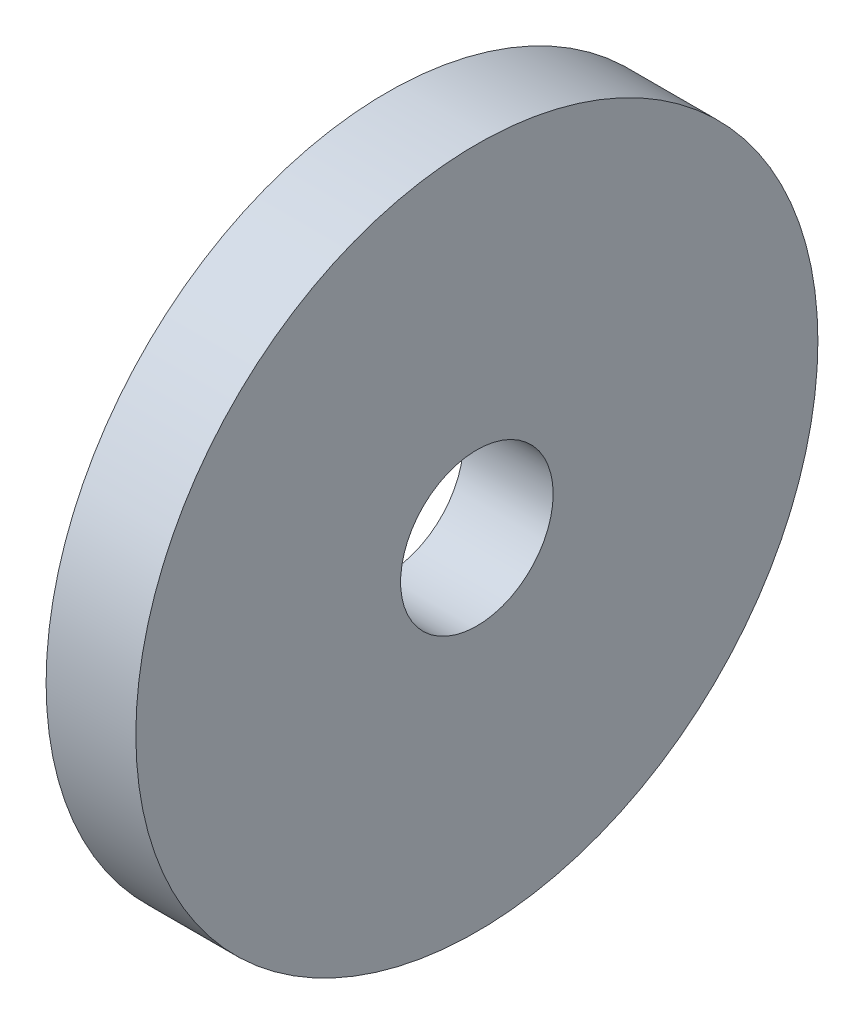
ISO-10303-21;
HEADER;
FILE_DESCRIPTION(('STEP AP214'),'2;1');
FILE_NAME('part.step','',(''),(''),'','','');
FILE_SCHEMA(('AUTOMOTIVE_DESIGN { 1 0 10303 214 1 1 1 1 }'));
ENDSEC;
DATA;
#1=APPLICATION_CONTEXT('core data for automotive mechanical design processes');
#2=APPLICATION_PROTOCOL_DEFINITION('international standard','automotive_design',2000,#1);
#3=PRODUCT_CONTEXT('',#1,'mechanical');
#4=PRODUCT('Part','Part','',(#3));
#5=PRODUCT_RELATED_PRODUCT_CATEGORY('part','',(#4));
#6=PRODUCT_DEFINITION_FORMATION('','',#4);
#7=PRODUCT_DEFINITION_CONTEXT('part definition',#1,'design');
#8=PRODUCT_DEFINITION('design','',#6,#7);
#9=PRODUCT_DEFINITION_SHAPE('','',#8);
#10=(LENGTH_UNIT() NAMED_UNIT(*) SI_UNIT(.MILLI.,.METRE.));
#11=(NAMED_UNIT(*) PLANE_ANGLE_UNIT() SI_UNIT($,.RADIAN.));
#12=(NAMED_UNIT(*) SI_UNIT($,.STERADIAN.) SOLID_ANGLE_UNIT());
#13=UNCERTAINTY_MEASURE_WITH_UNIT(LENGTH_MEASURE(1.E-05),#10,'distance_accuracy_value','');
#14=(GEOMETRIC_REPRESENTATION_CONTEXT(3) GLOBAL_UNCERTAINTY_ASSIGNED_CONTEXT((#13)) GLOBAL_UNIT_ASSIGNED_CONTEXT((#10,
#11,#12)) REPRESENTATION_CONTEXT('',''));
#15=CARTESIAN_POINT('',(0.,0.,0.));
#16=DIRECTION('',(0.,0.,1.));
#17=DIRECTION('',(1.,0.,0.));
#18=AXIS2_PLACEMENT_3D('',#15,#16,#17);
#19=CARTESIAN_POINT('',(5.,0.,0.));
#20=DIRECTION('',(1.,0.,0.));
#21=DIRECTION('',(0.,0.,-1.));
#22=AXIS2_PLACEMENT_3D('',#19,#20,#21);
#23=PLANE('',#22);
#24=CARTESIAN_POINT('',(5.,0.,0.));
#25=DIRECTION('',(1.,0.,0.));
#26=DIRECTION('',(0.,0.,-1.));
#27=AXIS2_PLACEMENT_3D('',#24,#25,#26);
#28=CIRCLE('',#27,19.);
#29=CARTESIAN_POINT('',(5.,0.,-19.));
#30=VERTEX_POINT('',#29);
#31=EDGE_CURVE('E10',#30,#30,#28,.T.);
#32=ORIENTED_EDGE('',*,*,#31,.T.);
#33=EDGE_LOOP('',(#32));
#34=FACE_BOUND('',#33,.T.);
#35=CARTESIAN_POINT('',(5.,0.,0.));
#36=DIRECTION('',(1.,0.,0.));
#37=DIRECTION('',(0.,0.,-1.));
#38=AXIS2_PLACEMENT_3D('',#35,#36,#37);
#39=CIRCLE('',#38,4.25);
#40=CARTESIAN_POINT('',(5.,0.,-4.25));
#41=VERTEX_POINT('',#40);
#42=EDGE_CURVE('E54',#41,#41,#39,.T.);
#43=ORIENTED_EDGE('',*,*,#42,.F.);
#44=EDGE_LOOP('',(#43));
#45=FACE_BOUND('',#44,.T.);
#46=ADVANCED_FACE('F41',(#34,#45),#23,.T.);
#47=CARTESIAN_POINT('',(0.,0.,0.));
#48=DIRECTION('',(1.,0.,0.));
#49=DIRECTION('',(0.,0.,-1.));
#50=AXIS2_PLACEMENT_3D('',#47,#48,#49);
#51=PLANE('',#50);
#52=CARTESIAN_POINT('',(0.,0.,0.));
#53=DIRECTION('',(1.,0.,0.));
#54=DIRECTION('',(0.,0.,-1.));
#55=AXIS2_PLACEMENT_3D('',#52,#53,#54);
#56=CIRCLE('',#55,19.);
#57=CARTESIAN_POINT('',(0.,0.,-19.));
#58=VERTEX_POINT('',#57);
#59=EDGE_CURVE('E45',#58,#58,#56,.T.);
#60=ORIENTED_EDGE('',*,*,#59,.F.);
#61=EDGE_LOOP('',(#60));
#62=FACE_BOUND('',#61,.T.);
#63=CARTESIAN_POINT('',(0.,0.,0.));
#64=DIRECTION('',(1.,0.,0.));
#65=DIRECTION('',(0.,0.,-1.));
#66=AXIS2_PLACEMENT_3D('',#63,#64,#65);
#67=CIRCLE('',#66,4.25);
#68=CARTESIAN_POINT('',(0.,0.,-4.25));
#69=VERTEX_POINT('',#68);
#70=EDGE_CURVE('E56',#69,#69,#67,.T.);
#71=ORIENTED_EDGE('',*,*,#70,.T.);
#72=EDGE_LOOP('',(#71));
#73=FACE_BOUND('',#72,.T.);
#74=ADVANCED_FACE('F68',(#62,#73),#51,.F.);
#75=CARTESIAN_POINT('',(5.,0.,0.));
#76=DIRECTION('',(-1.,0.,0.));
#77=DIRECTION('',(0.,0.,1.));
#78=AXIS2_PLACEMENT_3D('',#75,#76,#77);
#79=CYLINDRICAL_SURFACE('',#78,19.);
#80=ORIENTED_EDGE('',*,*,#31,.F.);
#81=EDGE_LOOP('',(#80));
#82=FACE_BOUND('',#81,.T.);
#83=ORIENTED_EDGE('',*,*,#59,.T.);
#84=EDGE_LOOP('',(#83));
#85=FACE_BOUND('',#84,.T.);
#86=ADVANCED_FACE('F43',(#82,#85),#79,.T.);
#87=CARTESIAN_POINT('',(5.,0.,0.));
#88=DIRECTION('',(-1.,0.,0.));
#89=DIRECTION('',(0.,0.,1.));
#90=AXIS2_PLACEMENT_3D('',#87,#88,#89);
#91=CYLINDRICAL_SURFACE('',#90,4.25);
#92=ORIENTED_EDGE('',*,*,#42,.T.);
#93=EDGE_LOOP('',(#92));
#94=FACE_BOUND('',#93,.T.);
#95=ORIENTED_EDGE('',*,*,#70,.F.);
#96=EDGE_LOOP('',(#95));
#97=FACE_BOUND('',#96,.T.);
#98=ADVANCED_FACE('F64',(#94,#97),#91,.F.);
#99=CLOSED_SHELL('',(#46,#74,#86,#98));
#100=MANIFOLD_SOLID_BREP('B2',#99);
#101=ADVANCED_BREP_SHAPE_REPRESENTATION('',(#18,#100),#14);
#102=SHAPE_DEFINITION_REPRESENTATION(#9,#101);
ENDSEC;
END-ISO-10303-21;
